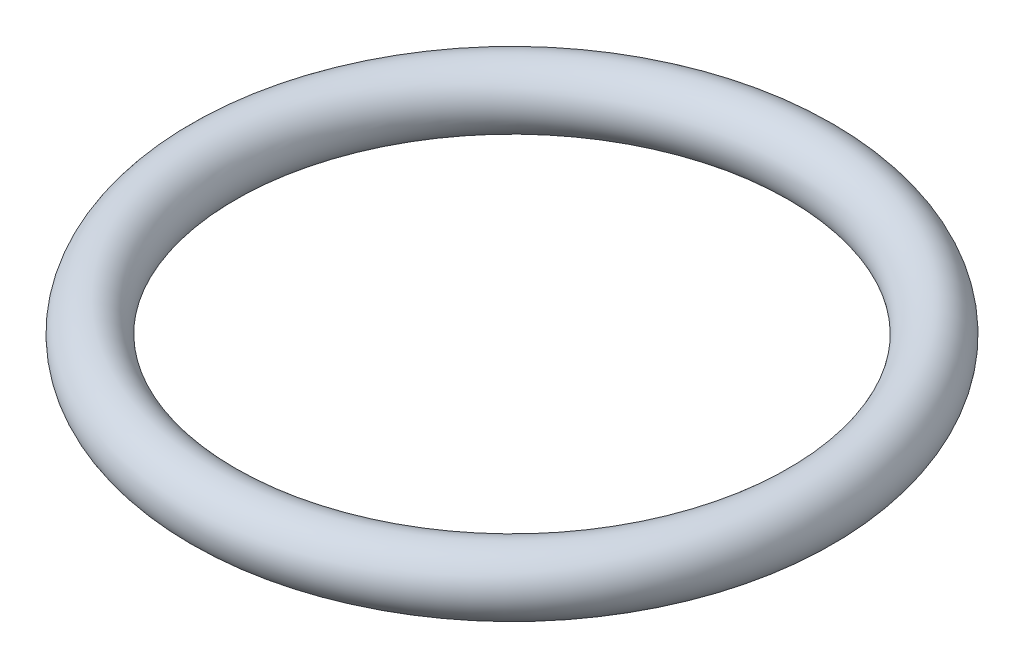
ISO-10303-21;
HEADER;
FILE_DESCRIPTION(('STEP AP214'),'2;1');
FILE_NAME('part.step','',(''),(''),'','','');
FILE_SCHEMA(('AUTOMOTIVE_DESIGN { 1 0 10303 214 1 1 1 1 }'));
ENDSEC;
DATA;
#1=APPLICATION_CONTEXT('core data for automotive mechanical design processes');
#2=APPLICATION_PROTOCOL_DEFINITION('international standard','automotive_design',2000,#1);
#3=PRODUCT_CONTEXT('',#1,'mechanical');
#4=PRODUCT('Part','Part','',(#3));
#5=PRODUCT_RELATED_PRODUCT_CATEGORY('part','',(#4));
#6=PRODUCT_DEFINITION_FORMATION('','',#4);
#7=PRODUCT_DEFINITION_CONTEXT('part definition',#1,'design');
#8=PRODUCT_DEFINITION('design','',#6,#7);
#9=PRODUCT_DEFINITION_SHAPE('','',#8);
#10=(LENGTH_UNIT() NAMED_UNIT(*) SI_UNIT(.MILLI.,.METRE.));
#11=(NAMED_UNIT(*) PLANE_ANGLE_UNIT() SI_UNIT($,.RADIAN.));
#12=(NAMED_UNIT(*) SI_UNIT($,.STERADIAN.) SOLID_ANGLE_UNIT());
#13=UNCERTAINTY_MEASURE_WITH_UNIT(LENGTH_MEASURE(1.E-05),#10,'distance_accuracy_value','');
#14=(GEOMETRIC_REPRESENTATION_CONTEXT(3) GLOBAL_UNCERTAINTY_ASSIGNED_CONTEXT((#13)) GLOBAL_UNIT_ASSIGNED_CONTEXT((#10,
#11,#12)) REPRESENTATION_CONTEXT('',''));
#15=CARTESIAN_POINT('',(0.,0.,0.));
#16=DIRECTION('',(0.,0.,1.));
#17=DIRECTION('',(1.,0.,0.));
#18=AXIS2_PLACEMENT_3D('',#15,#16,#17);
#19=CARTESIAN_POINT('',(0.,0.,0.));
#20=DIRECTION('',(0.,-1.,0.));
#21=DIRECTION('',(0.,0.,-1.));
#22=AXIS2_PLACEMENT_3D('',#19,#20,#21);
#23=TOROIDAL_SURFACE('',#22,9.525,0.990599999999999);
#24=CARTESIAN_POINT('',(0.,0.,-10.5156));
#25=VERTEX_POINT('',#24);
#26=VERTEX_LOOP('',#25);
#27=FACE_BOUND('',#26,.T.);
#28=ADVANCED_FACE('F29',(#27),#23,.T.);
#29=CLOSED_SHELL('',(#28));
#30=MANIFOLD_SOLID_BREP('B2',#29);
#31=ADVANCED_BREP_SHAPE_REPRESENTATION('',(#18,#30),#14);
#32=SHAPE_DEFINITION_REPRESENTATION(#9,#31);
ENDSEC;
END-ISO-10303-21;
